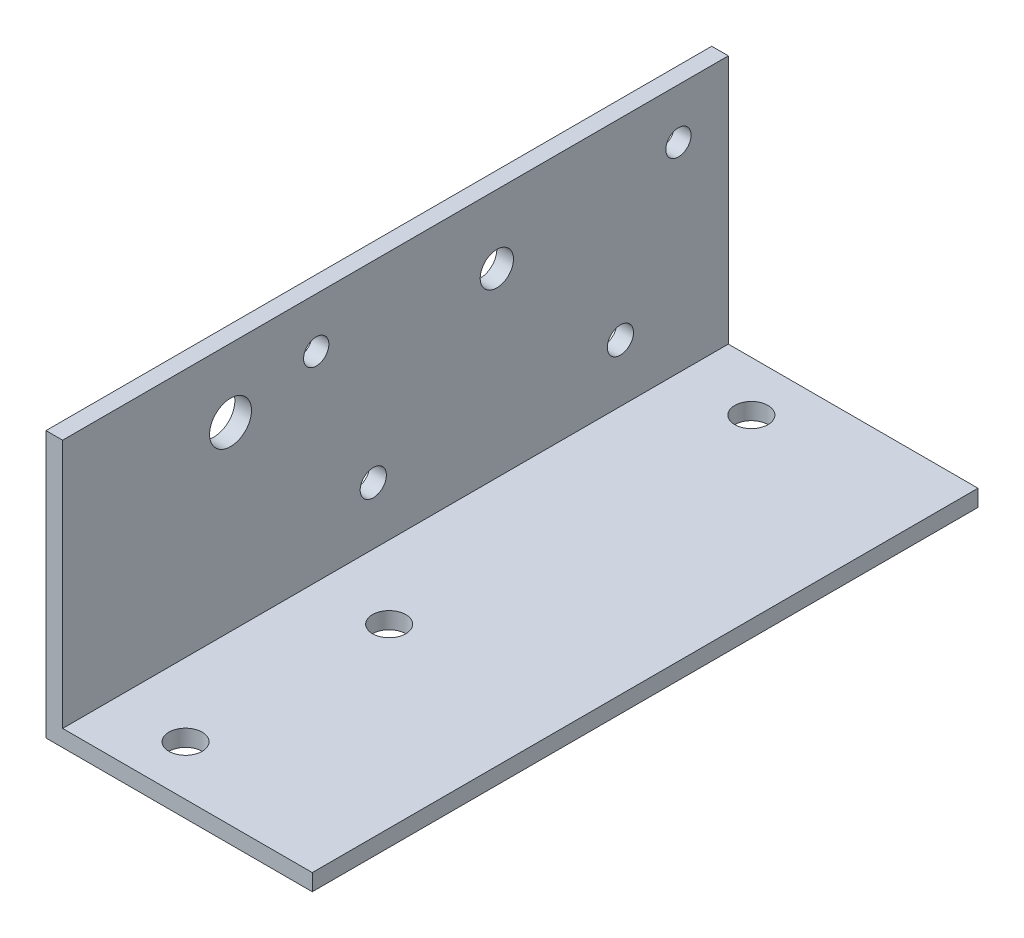
ISO-10303-21;
HEADER;
FILE_DESCRIPTION(('STEP AP214'),'2;1');
FILE_NAME('part.step','',(''),(''),'','','');
FILE_SCHEMA(('AUTOMOTIVE_DESIGN { 1 0 10303 214 1 1 1 1 }'));
ENDSEC;
DATA;
#1=APPLICATION_CONTEXT('core data for automotive mechanical design processes');
#2=APPLICATION_PROTOCOL_DEFINITION('international standard','automotive_design',2000,#1);
#3=PRODUCT_CONTEXT('',#1,'mechanical');
#4=PRODUCT('Part','Part','',(#3));
#5=PRODUCT_RELATED_PRODUCT_CATEGORY('part','',(#4));
#6=PRODUCT_DEFINITION_FORMATION('','',#4);
#7=PRODUCT_DEFINITION_CONTEXT('part definition',#1,'design');
#8=PRODUCT_DEFINITION('design','',#6,#7);
#9=PRODUCT_DEFINITION_SHAPE('','',#8);
#10=(LENGTH_UNIT() NAMED_UNIT(*) SI_UNIT(.MILLI.,.METRE.));
#11=(NAMED_UNIT(*) PLANE_ANGLE_UNIT() SI_UNIT($,.RADIAN.));
#12=(NAMED_UNIT(*) SI_UNIT($,.STERADIAN.) SOLID_ANGLE_UNIT());
#13=UNCERTAINTY_MEASURE_WITH_UNIT(LENGTH_MEASURE(1.E-05),#10,'distance_accuracy_value','');
#14=(GEOMETRIC_REPRESENTATION_CONTEXT(3) GLOBAL_UNCERTAINTY_ASSIGNED_CONTEXT((#13)) GLOBAL_UNIT_ASSIGNED_CONTEXT((#10,
#11,#12)) REPRESENTATION_CONTEXT('',''));
#15=CARTESIAN_POINT('',(0.,0.,0.));
#16=DIRECTION('',(0.,0.,1.));
#17=DIRECTION('',(1.,0.,0.));
#18=AXIS2_PLACEMENT_3D('',#15,#16,#17);
#19=CARTESIAN_POINT('',(50.8,0.,127.));
#20=DIRECTION('',(0.,1.,0.));
#21=DIRECTION('',(-1.,0.,0.));
#22=AXIS2_PLACEMENT_3D('',#19,#20,#21);
#23=PLANE('',#22);
#24=CARTESIAN_POINT('',(17.0942,0.,117.475));
#25=DIRECTION('',(0.,1.,0.));
#26=DIRECTION('',(-1.,0.,0.));
#27=AXIS2_PLACEMENT_3D('',#24,#25,#26);
#28=CIRCLE('',#27,3.175);
#29=CARTESIAN_POINT('',(13.9192,0.,117.475));
#30=VERTEX_POINT('',#29);
#31=EDGE_CURVE('E163',#30,#30,#28,.T.);
#32=ORIENTED_EDGE('',*,*,#31,.T.);
#33=EDGE_LOOP('',(#32));
#34=FACE_BOUND('',#33,.T.);
#35=CARTESIAN_POINT('',(17.0942,0.,78.624999976));
#36=DIRECTION('',(0.,1.,0.));
#37=DIRECTION('',(-1.,0.,0.));
#38=AXIS2_PLACEMENT_3D('',#35,#36,#37);
#39=CIRCLE('',#38,3.175);
#40=CARTESIAN_POINT('',(13.9192,0.,78.624999976));
#41=VERTEX_POINT('',#40);
#42=EDGE_CURVE('E167',#41,#41,#39,.T.);
#43=ORIENTED_EDGE('',*,*,#42,.T.);
#44=EDGE_LOOP('',(#43));
#45=FACE_BOUND('',#44,.T.);
#46=CARTESIAN_POINT('',(17.0942,0.,9.525));
#47=DIRECTION('',(0.,1.,0.));
#48=DIRECTION('',(-1.,0.,0.));
#49=AXIS2_PLACEMENT_3D('',#46,#47,#48);
#50=CIRCLE('',#49,3.175);
#51=CARTESIAN_POINT('',(13.9192,0.,9.525));
#52=VERTEX_POINT('',#51);
#53=EDGE_CURVE('E121',#52,#52,#50,.T.);
#54=ORIENTED_EDGE('',*,*,#53,.T.);
#55=EDGE_LOOP('',(#54));
#56=FACE_BOUND('',#55,.T.);
#57=DIRECTION('',(1.,0.,0.));
#58=VECTOR('',#57,1.);
#59=CARTESIAN_POINT('',(50.8,0.,0.));
#60=LINE('',#59,#58);
#61=CARTESIAN_POINT('',(0.,0.,0.));
#62=VERTEX_POINT('',#61);
#63=CARTESIAN_POINT('',(50.8,0.,0.));
#64=VERTEX_POINT('',#63);
#65=EDGE_CURVE('E117',#62,#64,#60,.T.);
#66=ORIENTED_EDGE('',*,*,#65,.T.);
#67=DIRECTION('',(0.,0.,-1.));
#68=VECTOR('',#67,1.);
#69=CARTESIAN_POINT('',(50.8,0.,127.));
#70=LINE('',#69,#68);
#71=CARTESIAN_POINT('',(50.8,0.,127.));
#72=VERTEX_POINT('',#71);
#73=EDGE_CURVE('E11',#72,#64,#70,.T.);
#74=ORIENTED_EDGE('',*,*,#73,.F.);
#75=DIRECTION('',(1.,0.,0.));
#76=VECTOR('',#75,1.);
#77=CARTESIAN_POINT('',(50.8,0.,127.));
#78=LINE('',#77,#76);
#79=CARTESIAN_POINT('',(0.,0.,127.));
#80=VERTEX_POINT('',#79);
#81=EDGE_CURVE('E128',#80,#72,#78,.T.);
#82=ORIENTED_EDGE('',*,*,#81,.F.);
#83=DIRECTION('',(0.,0.,-1.));
#84=VECTOR('',#83,1.);
#85=CARTESIAN_POINT('',(0.,0.,127.));
#86=LINE('',#85,#84);
#87=EDGE_CURVE('E113',#80,#62,#86,.T.);
#88=ORIENTED_EDGE('',*,*,#87,.T.);
#89=EDGE_LOOP('',(#66,#74,#82,#88));
#90=FACE_BOUND('',#89,.T.);
#91=ADVANCED_FACE('F33',(#34,#45,#56,#90),#23,.F.);
#92=CARTESIAN_POINT('',(50.8,3.175,127.));
#93=DIRECTION('',(-1.,0.,0.));
#94=DIRECTION('',(0.,0.,1.));
#95=AXIS2_PLACEMENT_3D('',#92,#93,#94);
#96=PLANE('',#95);
#97=DIRECTION('',(0.,1.,0.));
#98=VECTOR('',#97,1.);
#99=CARTESIAN_POINT('',(50.8,3.175,0.));
#100=LINE('',#99,#98);
#101=CARTESIAN_POINT('',(50.8,3.175,0.));
#102=VERTEX_POINT('',#101);
#103=EDGE_CURVE('E120',#64,#102,#100,.T.);
#104=ORIENTED_EDGE('',*,*,#103,.T.);
#105=DIRECTION('',(0.,0.,-1.));
#106=VECTOR('',#105,1.);
#107=CARTESIAN_POINT('',(50.8,3.175,127.));
#108=LINE('',#107,#106);
#109=CARTESIAN_POINT('',(50.8,3.175,127.));
#110=VERTEX_POINT('',#109);
#111=EDGE_CURVE('E41',#110,#102,#108,.T.);
#112=ORIENTED_EDGE('',*,*,#111,.F.);
#113=DIRECTION('',(0.,1.,0.));
#114=VECTOR('',#113,1.);
#115=CARTESIAN_POINT('',(50.8,3.175,127.));
#116=LINE('',#115,#114);
#117=EDGE_CURVE('E86',#72,#110,#116,.T.);
#118=ORIENTED_EDGE('',*,*,#117,.F.);
#119=ORIENTED_EDGE('',*,*,#73,.T.);
#120=EDGE_LOOP('',(#104,#112,#118,#119));
#121=FACE_BOUND('',#120,.T.);
#122=ADVANCED_FACE('F155',(#121),#96,.F.);
#123=CARTESIAN_POINT('',(3.17500000000001,3.175,127.));
#124=DIRECTION('',(0.,-1.,0.));
#125=DIRECTION('',(1.,0.,0.));
#126=AXIS2_PLACEMENT_3D('',#123,#124,#125);
#127=PLANE('',#126);
#128=CARTESIAN_POINT('',(17.0942,3.175,117.475));
#129=DIRECTION('',(0.,1.,0.));
#130=DIRECTION('',(-1.,0.,0.));
#131=AXIS2_PLACEMENT_3D('',#128,#129,#130);
#132=CIRCLE('',#131,3.175);
#133=CARTESIAN_POINT('',(13.9192,3.175,117.475));
#134=VERTEX_POINT('',#133);
#135=EDGE_CURVE('E182',#134,#134,#132,.T.);
#136=ORIENTED_EDGE('',*,*,#135,.F.);
#137=EDGE_LOOP('',(#136));
#138=FACE_BOUND('',#137,.T.);
#139=CARTESIAN_POINT('',(17.0942,3.175,78.624999976));
#140=DIRECTION('',(0.,1.,0.));
#141=DIRECTION('',(-1.,0.,0.));
#142=AXIS2_PLACEMENT_3D('',#139,#140,#141);
#143=CIRCLE('',#142,3.175);
#144=CARTESIAN_POINT('',(13.9192,3.175,78.624999976));
#145=VERTEX_POINT('',#144);
#146=EDGE_CURVE('E176',#145,#145,#143,.T.);
#147=ORIENTED_EDGE('',*,*,#146,.F.);
#148=EDGE_LOOP('',(#147));
#149=FACE_BOUND('',#148,.T.);
#150=CARTESIAN_POINT('',(17.0942,3.175,9.525));
#151=DIRECTION('',(0.,1.,0.));
#152=DIRECTION('',(-1.,0.,0.));
#153=AXIS2_PLACEMENT_3D('',#150,#151,#152);
#154=CIRCLE('',#153,3.175);
#155=CARTESIAN_POINT('',(13.9192,3.175,9.525));
#156=VERTEX_POINT('',#155);
#157=EDGE_CURVE('E171',#156,#156,#154,.T.);
#158=ORIENTED_EDGE('',*,*,#157,.F.);
#159=EDGE_LOOP('',(#158));
#160=FACE_BOUND('',#159,.T.);
#161=DIRECTION('',(-1.,0.,0.));
#162=VECTOR('',#161,1.);
#163=CARTESIAN_POINT('',(3.17500000000001,3.175,0.));
#164=LINE('',#163,#162);
#165=CARTESIAN_POINT('',(3.17500000000001,3.175,0.));
#166=VERTEX_POINT('',#165);
#167=EDGE_CURVE('E123',#102,#166,#164,.T.);
#168=ORIENTED_EDGE('',*,*,#167,.T.);
#169=DIRECTION('',(0.,0.,-1.));
#170=VECTOR('',#169,1.);
#171=CARTESIAN_POINT('',(3.17500000000001,3.175,127.));
#172=LINE('',#171,#170);
#173=CARTESIAN_POINT('',(3.17500000000001,3.175,127.));
#174=VERTEX_POINT('',#173);
#175=EDGE_CURVE('E108',#174,#166,#172,.T.);
#176=ORIENTED_EDGE('',*,*,#175,.F.);
#177=DIRECTION('',(-1.,0.,0.));
#178=VECTOR('',#177,1.);
#179=CARTESIAN_POINT('',(3.17500000000001,3.175,127.));
#180=LINE('',#179,#178);
#181=EDGE_CURVE('E99',#110,#174,#180,.T.);
#182=ORIENTED_EDGE('',*,*,#181,.F.);
#183=ORIENTED_EDGE('',*,*,#111,.T.);
#184=EDGE_LOOP('',(#168,#176,#182,#183));
#185=FACE_BOUND('',#184,.T.);
#186=ADVANCED_FACE('F134',(#138,#149,#160,#185),#127,.F.);
#187=CARTESIAN_POINT('',(3.175,50.8,127.));
#188=DIRECTION('',(-1.,0.,0.));
#189=DIRECTION('',(0.,-1.,0.));
#190=AXIS2_PLACEMENT_3D('',#187,#188,#189);
#191=PLANE('',#190);
#192=CARTESIAN_POINT('',(3.175,37.725,94.9706));
#193=DIRECTION('',(-1.,0.,0.));
#194=DIRECTION('',(0.,-1.,0.));
#195=AXIS2_PLACEMENT_3D('',#192,#193,#194);
#196=CIRCLE('',#195,4.00000000000001);
#197=CARTESIAN_POINT('',(3.175,33.725,94.9706));
#198=VERTEX_POINT('',#197);
#199=EDGE_CURVE('E216',#198,#198,#196,.T.);
#200=ORIENTED_EDGE('',*,*,#199,.T.);
#201=EDGE_LOOP('',(#200));
#202=FACE_BOUND('',#201,.T.);
#203=CARTESIAN_POINT('',(3.175,37.725,44.1706));
#204=DIRECTION('',(-1.,0.,0.));
#205=DIRECTION('',(0.,-1.,0.));
#206=AXIS2_PLACEMENT_3D('',#203,#204,#205);
#207=CIRCLE('',#206,3.175);
#208=CARTESIAN_POINT('',(3.175,34.55,44.1706));
#209=VERTEX_POINT('',#208);
#210=EDGE_CURVE('E210',#209,#209,#207,.T.);
#211=ORIENTED_EDGE('',*,*,#210,.T.);
#212=EDGE_LOOP('',(#211));
#213=FACE_BOUND('',#212,.T.);
#214=CARTESIAN_POINT('',(3.175,41.275,78.625));
#215=DIRECTION('',(-1.,0.,0.));
#216=DIRECTION('',(0.,-1.,0.));
#217=AXIS2_PLACEMENT_3D('',#214,#215,#216);
#218=CIRCLE('',#217,2.41299999999999);
#219=CARTESIAN_POINT('',(3.175,38.862,78.625));
#220=VERTEX_POINT('',#219);
#221=EDGE_CURVE('E204',#220,#220,#218,.T.);
#222=ORIENTED_EDGE('',*,*,#221,.T.);
#223=EDGE_LOOP('',(#222));
#224=FACE_BOUND('',#223,.T.);
#225=CARTESIAN_POINT('',(3.175,14.155,67.7394));
#226=DIRECTION('',(-1.,0.,0.));
#227=DIRECTION('',(0.,-1.,0.));
#228=AXIS2_PLACEMENT_3D('',#225,#226,#227);
#229=CIRCLE('',#228,2.5);
#230=CARTESIAN_POINT('',(3.175,11.655,67.7394));
#231=VERTEX_POINT('',#230);
#232=EDGE_CURVE('E198',#231,#231,#229,.T.);
#233=ORIENTED_EDGE('',*,*,#232,.T.);
#234=EDGE_LOOP('',(#233));
#235=FACE_BOUND('',#234,.T.);
#236=CARTESIAN_POINT('',(3.175,41.275,9.52500000000001));
#237=DIRECTION('',(-1.,0.,0.));
#238=DIRECTION('',(0.,-1.,0.));
#239=AXIS2_PLACEMENT_3D('',#236,#237,#238);
#240=CIRCLE('',#239,2.413);
#241=CARTESIAN_POINT('',(3.175,38.862,9.52500000000001));
#242=VERTEX_POINT('',#241);
#243=EDGE_CURVE('E192',#242,#242,#240,.T.);
#244=ORIENTED_EDGE('',*,*,#243,.T.);
#245=EDGE_LOOP('',(#244));
#246=FACE_BOUND('',#245,.T.);
#247=CARTESIAN_POINT('',(3.175,14.155,20.5994));
#248=DIRECTION('',(-1.,0.,0.));
#249=DIRECTION('',(0.,-1.,0.));
#250=AXIS2_PLACEMENT_3D('',#247,#248,#249);
#251=CIRCLE('',#250,2.5);
#252=CARTESIAN_POINT('',(3.175,11.655,20.5994));
#253=VERTEX_POINT('',#252);
#254=EDGE_CURVE('E185',#253,#253,#251,.T.);
#255=ORIENTED_EDGE('',*,*,#254,.T.);
#256=EDGE_LOOP('',(#255));
#257=FACE_BOUND('',#256,.T.);
#258=DIRECTION('',(0.,1.,0.));
#259=VECTOR('',#258,1.);
#260=CARTESIAN_POINT('',(3.175,50.8,0.));
#261=LINE('',#260,#259);
#262=CARTESIAN_POINT('',(3.175,50.8,0.));
#263=VERTEX_POINT('',#262);
#264=EDGE_CURVE('E107',#166,#263,#261,.T.);
#265=ORIENTED_EDGE('',*,*,#264,.T.);
#266=DIRECTION('',(0.,0.,-1.));
#267=VECTOR('',#266,1.);
#268=CARTESIAN_POINT('',(3.175,50.8,127.));
#269=LINE('',#268,#267);
#270=CARTESIAN_POINT('',(3.175,50.8,127.));
#271=VERTEX_POINT('',#270);
#272=EDGE_CURVE('E104',#271,#263,#269,.T.);
#273=ORIENTED_EDGE('',*,*,#272,.F.);
#274=DIRECTION('',(0.,1.,0.));
#275=VECTOR('',#274,1.);
#276=CARTESIAN_POINT('',(3.175,50.8,127.));
#277=LINE('',#276,#275);
#278=EDGE_CURVE('E93',#174,#271,#277,.T.);
#279=ORIENTED_EDGE('',*,*,#278,.F.);
#280=ORIENTED_EDGE('',*,*,#175,.T.);
#281=EDGE_LOOP('',(#265,#273,#279,#280));
#282=FACE_BOUND('',#281,.T.);
#283=ADVANCED_FACE('F105',(#202,#213,#224,#235,#246,#257,#282),#191,.F.);
#284=CARTESIAN_POINT('',(0.,50.8,127.));
#285=DIRECTION('',(0.,-1.,0.));
#286=DIRECTION('',(0.,0.,-1.));
#287=AXIS2_PLACEMENT_3D('',#284,#285,#286);
#288=PLANE('',#287);
#289=DIRECTION('',(-1.,0.,0.));
#290=VECTOR('',#289,1.);
#291=CARTESIAN_POINT('',(0.,50.8,0.));
#292=LINE('',#291,#290);
#293=CARTESIAN_POINT('',(0.,50.8,0.));
#294=VERTEX_POINT('',#293);
#295=EDGE_CURVE('E72',#263,#294,#292,.T.);
#296=ORIENTED_EDGE('',*,*,#295,.T.);
#297=DIRECTION('',(0.,0.,-1.));
#298=VECTOR('',#297,1.);
#299=CARTESIAN_POINT('',(0.,50.8,127.));
#300=LINE('',#299,#298);
#301=CARTESIAN_POINT('',(0.,50.8,127.));
#302=VERTEX_POINT('',#301);
#303=EDGE_CURVE('E109',#302,#294,#300,.T.);
#304=ORIENTED_EDGE('',*,*,#303,.F.);
#305=DIRECTION('',(-1.,0.,0.));
#306=VECTOR('',#305,1.);
#307=CARTESIAN_POINT('',(0.,50.8,127.));
#308=LINE('',#307,#306);
#309=EDGE_CURVE('E97',#271,#302,#308,.T.);
#310=ORIENTED_EDGE('',*,*,#309,.F.);
#311=ORIENTED_EDGE('',*,*,#272,.T.);
#312=EDGE_LOOP('',(#296,#304,#310,#311));
#313=FACE_BOUND('',#312,.T.);
#314=ADVANCED_FACE('F111',(#313),#288,.F.);
#315=CARTESIAN_POINT('',(0.,0.,127.));
#316=DIRECTION('',(1.,0.,0.));
#317=DIRECTION('',(0.,0.,-1.));
#318=AXIS2_PLACEMENT_3D('',#315,#316,#317);
#319=PLANE('',#318);
#320=CARTESIAN_POINT('',(0.,37.725,94.9706));
#321=DIRECTION('',(-1.,0.,0.));
#322=DIRECTION('',(0.,0.,1.));
#323=AXIS2_PLACEMENT_3D('',#320,#321,#322);
#324=CIRCLE('',#323,4.00000000000001);
#325=CARTESIAN_POINT('',(0.,37.725,98.9706));
#326=VERTEX_POINT('',#325);
#327=EDGE_CURVE('E219',#326,#326,#324,.T.);
#328=ORIENTED_EDGE('',*,*,#327,.F.);
#329=EDGE_LOOP('',(#328));
#330=FACE_BOUND('',#329,.T.);
#331=CARTESIAN_POINT('',(0.,37.725,44.1706));
#332=DIRECTION('',(-1.,0.,0.));
#333=DIRECTION('',(0.,0.,1.));
#334=AXIS2_PLACEMENT_3D('',#331,#332,#333);
#335=CIRCLE('',#334,3.175);
#336=CARTESIAN_POINT('',(0.,37.725,47.3456));
#337=VERTEX_POINT('',#336);
#338=EDGE_CURVE('E213',#337,#337,#335,.T.);
#339=ORIENTED_EDGE('',*,*,#338,.F.);
#340=EDGE_LOOP('',(#339));
#341=FACE_BOUND('',#340,.T.);
#342=CARTESIAN_POINT('',(0.,41.275,78.625));
#343=DIRECTION('',(-1.,0.,0.));
#344=DIRECTION('',(0.,0.,1.));
#345=AXIS2_PLACEMENT_3D('',#342,#343,#344);
#346=CIRCLE('',#345,2.41299999999999);
#347=CARTESIAN_POINT('',(0.,41.275,81.038));
#348=VERTEX_POINT('',#347);
#349=EDGE_CURVE('E207',#348,#348,#346,.T.);
#350=ORIENTED_EDGE('',*,*,#349,.F.);
#351=EDGE_LOOP('',(#350));
#352=FACE_BOUND('',#351,.T.);
#353=CARTESIAN_POINT('',(0.,14.155,67.7394));
#354=DIRECTION('',(-1.,0.,0.));
#355=DIRECTION('',(0.,0.,1.));
#356=AXIS2_PLACEMENT_3D('',#353,#354,#355);
#357=CIRCLE('',#356,2.5);
#358=CARTESIAN_POINT('',(0.,14.155,70.2394));
#359=VERTEX_POINT('',#358);
#360=EDGE_CURVE('E201',#359,#359,#357,.T.);
#361=ORIENTED_EDGE('',*,*,#360,.F.);
#362=EDGE_LOOP('',(#361));
#363=FACE_BOUND('',#362,.T.);
#364=CARTESIAN_POINT('',(0.,41.275,9.52500000000001));
#365=DIRECTION('',(-1.,0.,0.));
#366=DIRECTION('',(0.,0.,1.));
#367=AXIS2_PLACEMENT_3D('',#364,#365,#366);
#368=CIRCLE('',#367,2.413);
#369=CARTESIAN_POINT('',(0.,41.275,11.938));
#370=VERTEX_POINT('',#369);
#371=EDGE_CURVE('E195',#370,#370,#368,.T.);
#372=ORIENTED_EDGE('',*,*,#371,.F.);
#373=EDGE_LOOP('',(#372));
#374=FACE_BOUND('',#373,.T.);
#375=CARTESIAN_POINT('',(0.,14.155,20.5994));
#376=DIRECTION('',(-1.,0.,0.));
#377=DIRECTION('',(0.,0.,1.));
#378=AXIS2_PLACEMENT_3D('',#375,#376,#377);
#379=CIRCLE('',#378,2.5);
#380=CARTESIAN_POINT('',(0.,14.155,23.0994));
#381=VERTEX_POINT('',#380);
#382=EDGE_CURVE('E189',#381,#381,#379,.T.);
#383=ORIENTED_EDGE('',*,*,#382,.F.);
#384=EDGE_LOOP('',(#383));
#385=FACE_BOUND('',#384,.T.);
#386=DIRECTION('',(0.,-1.,0.));
#387=VECTOR('',#386,1.);
#388=CARTESIAN_POINT('',(0.,0.,0.));
#389=LINE('',#388,#387);
#390=EDGE_CURVE('E78',#294,#62,#389,.T.);
#391=ORIENTED_EDGE('',*,*,#390,.T.);
#392=ORIENTED_EDGE('',*,*,#87,.F.);
#393=DIRECTION('',(0.,-1.,0.));
#394=VECTOR('',#393,1.);
#395=CARTESIAN_POINT('',(0.,0.,127.));
#396=LINE('',#395,#394);
#397=EDGE_CURVE('E49',#302,#80,#396,.T.);
#398=ORIENTED_EDGE('',*,*,#397,.F.);
#399=ORIENTED_EDGE('',*,*,#303,.T.);
#400=EDGE_LOOP('',(#391,#392,#398,#399));
#401=FACE_BOUND('',#400,.T.);
#402=ADVANCED_FACE('F141',(#330,#341,#352,#363,#374,#385,#401),#319,.F.);
#403=CARTESIAN_POINT('',(0.,0.,127.));
#404=DIRECTION('',(0.,0.,-1.));
#405=DIRECTION('',(-1.,0.,0.));
#406=AXIS2_PLACEMENT_3D('',#403,#404,#405);
#407=PLANE('',#406);
#408=ORIENTED_EDGE('',*,*,#81,.T.);
#409=ORIENTED_EDGE('',*,*,#117,.T.);
#410=ORIENTED_EDGE('',*,*,#181,.T.);
#411=ORIENTED_EDGE('',*,*,#278,.T.);
#412=ORIENTED_EDGE('',*,*,#309,.T.);
#413=ORIENTED_EDGE('',*,*,#397,.T.);
#414=EDGE_LOOP('',(#408,#409,#410,#411,#412,#413));
#415=FACE_BOUND('',#414,.T.);
#416=ADVANCED_FACE('F95',(#415),#407,.F.);
#417=CARTESIAN_POINT('',(0.,0.,0.));
#418=DIRECTION('',(0.,0.,-1.));
#419=DIRECTION('',(-1.,0.,0.));
#420=AXIS2_PLACEMENT_3D('',#417,#418,#419);
#421=PLANE('',#420);
#422=ORIENTED_EDGE('',*,*,#65,.F.);
#423=ORIENTED_EDGE('',*,*,#390,.F.);
#424=ORIENTED_EDGE('',*,*,#295,.F.);
#425=ORIENTED_EDGE('',*,*,#264,.F.);
#426=ORIENTED_EDGE('',*,*,#167,.F.);
#427=ORIENTED_EDGE('',*,*,#103,.F.);
#428=EDGE_LOOP('',(#422,#423,#424,#425,#426,#427));
#429=FACE_BOUND('',#428,.T.);
#430=ADVANCED_FACE('F137',(#429),#421,.T.);
#431=CARTESIAN_POINT('',(17.0942,0.,9.525));
#432=DIRECTION('',(0.,1.,0.));
#433=DIRECTION('',(-1.,0.,0.));
#434=AXIS2_PLACEMENT_3D('',#431,#432,#433);
#435=CYLINDRICAL_SURFACE('',#434,3.175);
#436=ORIENTED_EDGE('',*,*,#53,.F.);
#437=EDGE_LOOP('',(#436));
#438=FACE_BOUND('',#437,.T.);
#439=ORIENTED_EDGE('',*,*,#157,.T.);
#440=EDGE_LOOP('',(#439));
#441=FACE_BOUND('',#440,.T.);
#442=ADVANCED_FACE('F262',(#438,#441),#435,.F.);
#443=CARTESIAN_POINT('',(17.0942,0.,78.624999976));
#444=DIRECTION('',(0.,1.,0.));
#445=DIRECTION('',(-1.,0.,0.));
#446=AXIS2_PLACEMENT_3D('',#443,#444,#445);
#447=CYLINDRICAL_SURFACE('',#446,3.175);
#448=ORIENTED_EDGE('',*,*,#42,.F.);
#449=EDGE_LOOP('',(#448));
#450=FACE_BOUND('',#449,.T.);
#451=ORIENTED_EDGE('',*,*,#146,.T.);
#452=EDGE_LOOP('',(#451));
#453=FACE_BOUND('',#452,.T.);
#454=ADVANCED_FACE('F255',(#450,#453),#447,.F.);
#455=CARTESIAN_POINT('',(17.0942,0.,117.475));
#456=DIRECTION('',(0.,1.,0.));
#457=DIRECTION('',(-1.,0.,0.));
#458=AXIS2_PLACEMENT_3D('',#455,#456,#457);
#459=CYLINDRICAL_SURFACE('',#458,3.175);
#460=ORIENTED_EDGE('',*,*,#31,.F.);
#461=EDGE_LOOP('',(#460));
#462=FACE_BOUND('',#461,.T.);
#463=ORIENTED_EDGE('',*,*,#135,.T.);
#464=EDGE_LOOP('',(#463));
#465=FACE_BOUND('',#464,.T.);
#466=ADVANCED_FACE('F245',(#462,#465),#459,.F.);
#467=CARTESIAN_POINT('',(50.8,14.155,20.5994));
#468=DIRECTION('',(-1.,0.,0.));
#469=DIRECTION('',(0.,0.,1.));
#470=AXIS2_PLACEMENT_3D('',#467,#468,#469);
#471=CYLINDRICAL_SURFACE('',#470,2.5);
#472=ORIENTED_EDGE('',*,*,#382,.T.);
#473=EDGE_LOOP('',(#472));
#474=FACE_BOUND('',#473,.T.);
#475=ORIENTED_EDGE('',*,*,#254,.F.);
#476=EDGE_LOOP('',(#475));
#477=FACE_BOUND('',#476,.T.);
#478=ADVANCED_FACE('F242',(#474,#477),#471,.F.);
#479=CARTESIAN_POINT('',(50.8,41.275,9.52500000000001));
#480=DIRECTION('',(-1.,0.,0.));
#481=DIRECTION('',(0.,0.,1.));
#482=AXIS2_PLACEMENT_3D('',#479,#480,#481);
#483=CYLINDRICAL_SURFACE('',#482,2.413);
#484=ORIENTED_EDGE('',*,*,#371,.T.);
#485=EDGE_LOOP('',(#484));
#486=FACE_BOUND('',#485,.T.);
#487=ORIENTED_EDGE('',*,*,#243,.F.);
#488=EDGE_LOOP('',(#487));
#489=FACE_BOUND('',#488,.T.);
#490=ADVANCED_FACE('F244',(#486,#489),#483,.F.);
#491=CARTESIAN_POINT('',(50.8,14.155,67.7394));
#492=DIRECTION('',(-1.,0.,0.));
#493=DIRECTION('',(0.,0.,1.));
#494=AXIS2_PLACEMENT_3D('',#491,#492,#493);
#495=CYLINDRICAL_SURFACE('',#494,2.5);
#496=ORIENTED_EDGE('',*,*,#360,.T.);
#497=EDGE_LOOP('',(#496));
#498=FACE_BOUND('',#497,.T.);
#499=ORIENTED_EDGE('',*,*,#232,.F.);
#500=EDGE_LOOP('',(#499));
#501=FACE_BOUND('',#500,.T.);
#502=ADVANCED_FACE('F252',(#498,#501),#495,.F.);
#503=CARTESIAN_POINT('',(50.8,41.275,78.625));
#504=DIRECTION('',(-1.,0.,0.));
#505=DIRECTION('',(0.,0.,1.));
#506=AXIS2_PLACEMENT_3D('',#503,#504,#505);
#507=CYLINDRICAL_SURFACE('',#506,2.41299999999999);
#508=ORIENTED_EDGE('',*,*,#349,.T.);
#509=EDGE_LOOP('',(#508));
#510=FACE_BOUND('',#509,.T.);
#511=ORIENTED_EDGE('',*,*,#221,.F.);
#512=EDGE_LOOP('',(#511));
#513=FACE_BOUND('',#512,.T.);
#514=ADVANCED_FACE('F316',(#510,#513),#507,.F.);
#515=CARTESIAN_POINT('',(50.8,37.725,44.1706));
#516=DIRECTION('',(-1.,0.,0.));
#517=DIRECTION('',(0.,0.,1.));
#518=AXIS2_PLACEMENT_3D('',#515,#516,#517);
#519=CYLINDRICAL_SURFACE('',#518,3.175);
#520=ORIENTED_EDGE('',*,*,#338,.T.);
#521=EDGE_LOOP('',(#520));
#522=FACE_BOUND('',#521,.T.);
#523=ORIENTED_EDGE('',*,*,#210,.F.);
#524=EDGE_LOOP('',(#523));
#525=FACE_BOUND('',#524,.T.);
#526=ADVANCED_FACE('F225',(#522,#525),#519,.F.);
#527=CARTESIAN_POINT('',(50.8,37.725,94.9706));
#528=DIRECTION('',(-1.,0.,0.));
#529=DIRECTION('',(0.,0.,1.));
#530=AXIS2_PLACEMENT_3D('',#527,#528,#529);
#531=CYLINDRICAL_SURFACE('',#530,4.00000000000001);
#532=ORIENTED_EDGE('',*,*,#327,.T.);
#533=EDGE_LOOP('',(#532));
#534=FACE_BOUND('',#533,.T.);
#535=ORIENTED_EDGE('',*,*,#199,.F.);
#536=EDGE_LOOP('',(#535));
#537=FACE_BOUND('',#536,.T.);
#538=ADVANCED_FACE('F222',(#534,#537),#531,.F.);
#539=CLOSED_SHELL('',(#91,#122,#186,#283,#314,#402,#416,#430,#442,#454,#466,#478,#490,#502,#514,
#526,#538));
#540=MANIFOLD_SOLID_BREP('B2',#539);
#541=ADVANCED_BREP_SHAPE_REPRESENTATION('',(#18,#540),#14);
#542=SHAPE_DEFINITION_REPRESENTATION(#9,#541);
ENDSEC;
END-ISO-10303-21;
